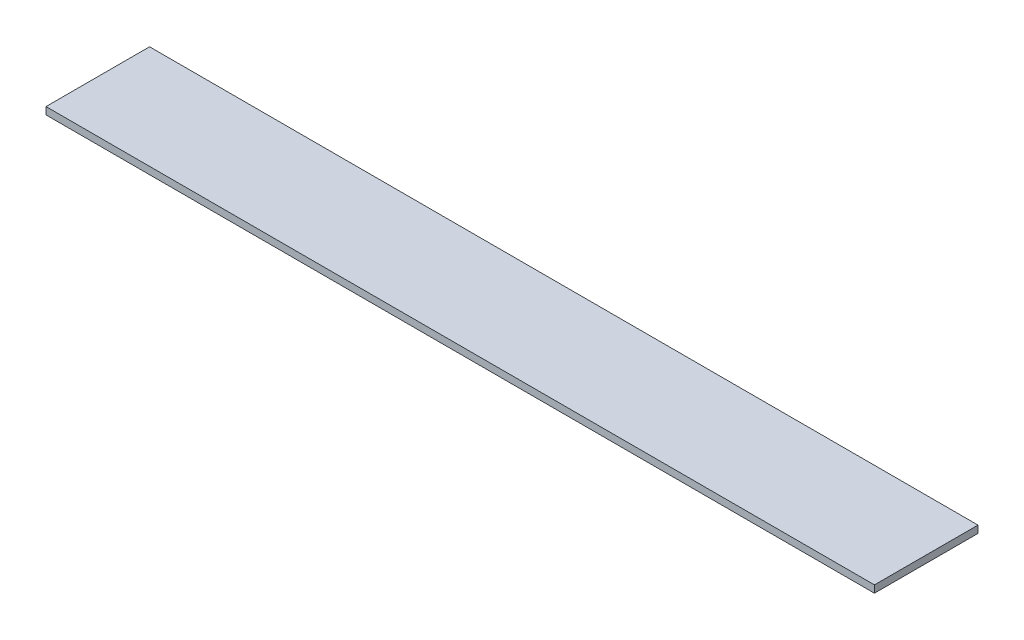
ISO-10303-21;
HEADER;
FILE_DESCRIPTION(('STEP AP214'),'2;1');
FILE_NAME('part.step','',(''),(''),'','','');
FILE_SCHEMA(('AUTOMOTIVE_DESIGN { 1 0 10303 214 1 1 1 1 }'));
ENDSEC;
DATA;
#1=APPLICATION_CONTEXT('core data for automotive mechanical design processes');
#2=APPLICATION_PROTOCOL_DEFINITION('international standard','automotive_design',2000,#1);
#3=PRODUCT_CONTEXT('',#1,'mechanical');
#4=PRODUCT('Part','Part','',(#3));
#5=PRODUCT_RELATED_PRODUCT_CATEGORY('part','',(#4));
#6=PRODUCT_DEFINITION_FORMATION('','',#4);
#7=PRODUCT_DEFINITION_CONTEXT('part definition',#1,'design');
#8=PRODUCT_DEFINITION('design','',#6,#7);
#9=PRODUCT_DEFINITION_SHAPE('','',#8);
#10=(LENGTH_UNIT() NAMED_UNIT(*) SI_UNIT(.MILLI.,.METRE.));
#11=(NAMED_UNIT(*) PLANE_ANGLE_UNIT() SI_UNIT($,.RADIAN.));
#12=(NAMED_UNIT(*) SI_UNIT($,.STERADIAN.) SOLID_ANGLE_UNIT());
#13=UNCERTAINTY_MEASURE_WITH_UNIT(LENGTH_MEASURE(1.E-05),#10,'distance_accuracy_value','');
#14=(GEOMETRIC_REPRESENTATION_CONTEXT(3) GLOBAL_UNCERTAINTY_ASSIGNED_CONTEXT((#13)) GLOBAL_UNIT_ASSIGNED_CONTEXT((#10,
#11,#12)) REPRESENTATION_CONTEXT('',''));
#15=CARTESIAN_POINT('',(0.,0.,0.));
#16=DIRECTION('',(0.,0.,1.));
#17=DIRECTION('',(1.,0.,0.));
#18=AXIS2_PLACEMENT_3D('',#15,#16,#17);
#19=CARTESIAN_POINT('',(40.,0.7,5.));
#20=DIRECTION('',(-1.,0.,0.));
#21=DIRECTION('',(0.,0.,1.));
#22=AXIS2_PLACEMENT_3D('',#19,#20,#21);
#23=PLANE('',#22);
#24=DIRECTION('',(0.,0.,-1.));
#25=VECTOR('',#24,1.);
#26=CARTESIAN_POINT('',(40.,0.,5.));
#27=LINE('',#26,#25);
#28=CARTESIAN_POINT('',(40.,0.,5.));
#29=VERTEX_POINT('',#28);
#30=CARTESIAN_POINT('',(40.,0.,-5.));
#31=VERTEX_POINT('',#30);
#32=EDGE_CURVE('E96',#29,#31,#27,.T.);
#33=ORIENTED_EDGE('',*,*,#32,.T.);
#34=DIRECTION('',(0.,-1.,0.));
#35=VECTOR('',#34,1.);
#36=CARTESIAN_POINT('',(40.,0.7,-5.));
#37=LINE('',#36,#35);
#38=CARTESIAN_POINT('',(40.,0.7,-5.));
#39=VERTEX_POINT('',#38);
#40=EDGE_CURVE('E11',#39,#31,#37,.T.);
#41=ORIENTED_EDGE('',*,*,#40,.F.);
#42=DIRECTION('',(0.,0.,-1.));
#43=VECTOR('',#42,1.);
#44=CARTESIAN_POINT('',(40.,0.7,5.));
#45=LINE('',#44,#43);
#46=CARTESIAN_POINT('',(40.,0.7,5.));
#47=VERTEX_POINT('',#46);
#48=EDGE_CURVE('E84',#47,#39,#45,.T.);
#49=ORIENTED_EDGE('',*,*,#48,.F.);
#50=DIRECTION('',(0.,-1.,0.));
#51=VECTOR('',#50,1.);
#52=CARTESIAN_POINT('',(40.,0.7,5.));
#53=LINE('',#52,#51);
#54=EDGE_CURVE('E92',#47,#29,#53,.T.);
#55=ORIENTED_EDGE('',*,*,#54,.T.);
#56=EDGE_LOOP('',(#33,#41,#49,#55));
#57=FACE_BOUND('',#56,.T.);
#58=ADVANCED_FACE('F33',(#57),#23,.F.);
#59=CARTESIAN_POINT('',(-40.,0.7,-5.));
#60=DIRECTION('',(0.,0.,1.));
#61=DIRECTION('',(1.,0.,0.));
#62=AXIS2_PLACEMENT_3D('',#59,#60,#61);
#63=PLANE('',#62);
#64=DIRECTION('',(-1.,0.,0.));
#65=VECTOR('',#64,1.);
#66=CARTESIAN_POINT('',(-40.,0.,-5.));
#67=LINE('',#66,#65);
#68=CARTESIAN_POINT('',(-40.,0.,-5.));
#69=VERTEX_POINT('',#68);
#70=EDGE_CURVE('E88',#31,#69,#67,.T.);
#71=ORIENTED_EDGE('',*,*,#70,.T.);
#72=DIRECTION('',(0.,-1.,0.));
#73=VECTOR('',#72,1.);
#74=CARTESIAN_POINT('',(-40.,0.7,-5.));
#75=LINE('',#74,#73);
#76=CARTESIAN_POINT('',(-40.,0.7,-5.));
#77=VERTEX_POINT('',#76);
#78=EDGE_CURVE('E41',#77,#69,#75,.T.);
#79=ORIENTED_EDGE('',*,*,#78,.F.);
#80=DIRECTION('',(-1.,0.,0.));
#81=VECTOR('',#80,1.);
#82=CARTESIAN_POINT('',(-40.,0.7,-5.));
#83=LINE('',#82,#81);
#84=EDGE_CURVE('E79',#39,#77,#83,.T.);
#85=ORIENTED_EDGE('',*,*,#84,.F.);
#86=ORIENTED_EDGE('',*,*,#40,.T.);
#87=EDGE_LOOP('',(#71,#79,#85,#86));
#88=FACE_BOUND('',#87,.T.);
#89=ADVANCED_FACE('F87',(#88),#63,.F.);
#90=CARTESIAN_POINT('',(-40.,0.7,5.));
#91=DIRECTION('',(1.,0.,0.));
#92=DIRECTION('',(0.,0.,-1.));
#93=AXIS2_PLACEMENT_3D('',#90,#91,#92);
#94=PLANE('',#93);
#95=DIRECTION('',(0.,0.,1.));
#96=VECTOR('',#95,1.);
#97=CARTESIAN_POINT('',(-40.,0.,5.));
#98=LINE('',#97,#96);
#99=CARTESIAN_POINT('',(-40.,0.,5.));
#100=VERTEX_POINT('',#99);
#101=EDGE_CURVE('E66',#69,#100,#98,.T.);
#102=ORIENTED_EDGE('',*,*,#101,.T.);
#103=DIRECTION('',(0.,-1.,0.));
#104=VECTOR('',#103,1.);
#105=CARTESIAN_POINT('',(-40.,0.7,5.));
#106=LINE('',#105,#104);
#107=CARTESIAN_POINT('',(-40.,0.7,5.));
#108=VERTEX_POINT('',#107);
#109=EDGE_CURVE('E89',#108,#100,#106,.T.);
#110=ORIENTED_EDGE('',*,*,#109,.F.);
#111=DIRECTION('',(0.,0.,1.));
#112=VECTOR('',#111,1.);
#113=CARTESIAN_POINT('',(-40.,0.7,5.));
#114=LINE('',#113,#112);
#115=EDGE_CURVE('E82',#77,#108,#114,.T.);
#116=ORIENTED_EDGE('',*,*,#115,.F.);
#117=ORIENTED_EDGE('',*,*,#78,.T.);
#118=EDGE_LOOP('',(#102,#110,#116,#117));
#119=FACE_BOUND('',#118,.T.);
#120=ADVANCED_FACE('F90',(#119),#94,.F.);
#121=CARTESIAN_POINT('',(-40.,0.7,5.));
#122=DIRECTION('',(0.,0.,-1.));
#123=DIRECTION('',(-1.,0.,0.));
#124=AXIS2_PLACEMENT_3D('',#121,#122,#123);
#125=PLANE('',#124);
#126=DIRECTION('',(1.,0.,0.));
#127=VECTOR('',#126,1.);
#128=CARTESIAN_POINT('',(-40.,0.,5.));
#129=LINE('',#128,#127);
#130=EDGE_CURVE('E72',#100,#29,#129,.T.);
#131=ORIENTED_EDGE('',*,*,#130,.T.);
#132=ORIENTED_EDGE('',*,*,#54,.F.);
#133=DIRECTION('',(1.,0.,0.));
#134=VECTOR('',#133,1.);
#135=CARTESIAN_POINT('',(-40.,0.7,5.));
#136=LINE('',#135,#134);
#137=EDGE_CURVE('E49',#108,#47,#136,.T.);
#138=ORIENTED_EDGE('',*,*,#137,.F.);
#139=ORIENTED_EDGE('',*,*,#109,.T.);
#140=EDGE_LOOP('',(#131,#132,#138,#139));
#141=FACE_BOUND('',#140,.T.);
#142=ADVANCED_FACE('F103',(#141),#125,.F.);
#143=CARTESIAN_POINT('',(0.,0.7,0.));
#144=DIRECTION('',(0.,-1.,0.));
#145=DIRECTION('',(0.,0.,-1.));
#146=AXIS2_PLACEMENT_3D('',#143,#144,#145);
#147=PLANE('',#146);
#148=ORIENTED_EDGE('',*,*,#48,.T.);
#149=ORIENTED_EDGE('',*,*,#84,.T.);
#150=ORIENTED_EDGE('',*,*,#115,.T.);
#151=ORIENTED_EDGE('',*,*,#137,.T.);
#152=EDGE_LOOP('',(#148,#149,#150,#151));
#153=FACE_BOUND('',#152,.T.);
#154=ADVANCED_FACE('F80',(#153),#147,.F.);
#155=CARTESIAN_POINT('',(0.,0.,0.));
#156=DIRECTION('',(0.,-1.,0.));
#157=DIRECTION('',(0.,0.,-1.));
#158=AXIS2_PLACEMENT_3D('',#155,#156,#157);
#159=PLANE('',#158);
#160=ORIENTED_EDGE('',*,*,#32,.F.);
#161=ORIENTED_EDGE('',*,*,#130,.F.);
#162=ORIENTED_EDGE('',*,*,#101,.F.);
#163=ORIENTED_EDGE('',*,*,#70,.F.);
#164=EDGE_LOOP('',(#160,#161,#162,#163));
#165=FACE_BOUND('',#164,.T.);
#166=ADVANCED_FACE('F106',(#165),#159,.T.);
#167=CLOSED_SHELL('',(#58,#89,#120,#142,#154,#166));
#168=MANIFOLD_SOLID_BREP('B2',#167);
#169=ADVANCED_BREP_SHAPE_REPRESENTATION('',(#18,#168),#14);
#170=SHAPE_DEFINITION_REPRESENTATION(#9,#169);
ENDSEC;
END-ISO-10303-21;
